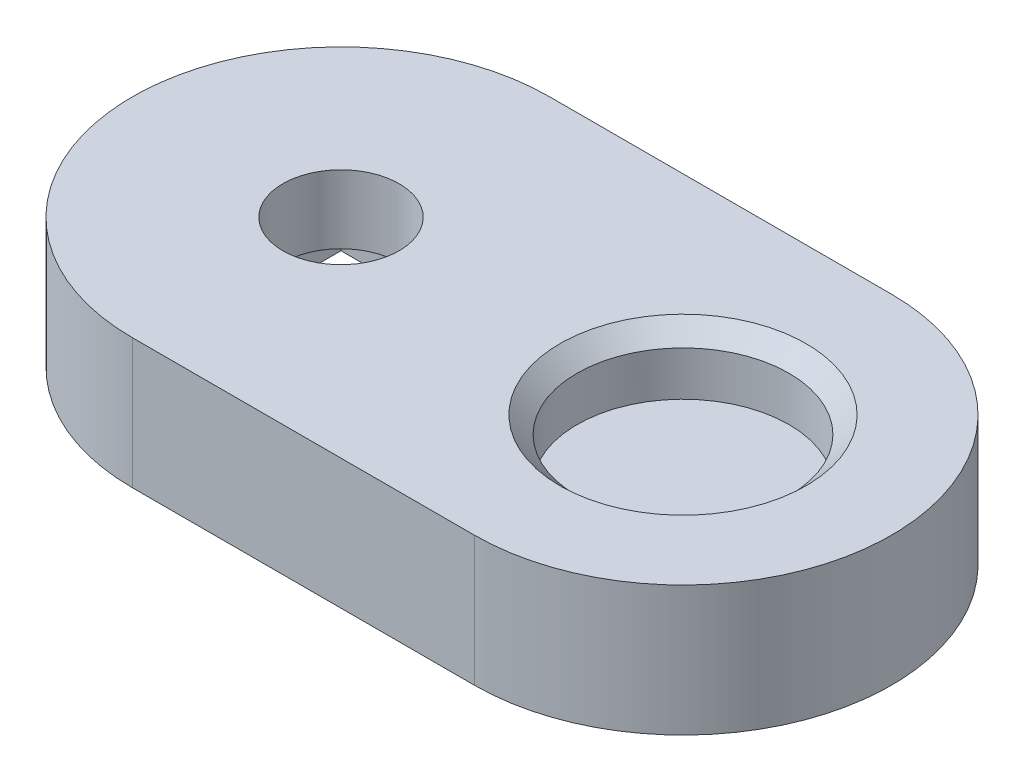
ISO-10303-21;
HEADER;
FILE_DESCRIPTION(('STEP AP214'),'2;1');
FILE_NAME('part.step','',(''),(''),'','','');
FILE_SCHEMA(('AUTOMOTIVE_DESIGN { 1 0 10303 214 1 1 1 1 }'));
ENDSEC;
DATA;
#1=APPLICATION_CONTEXT('core data for automotive mechanical design processes');
#2=APPLICATION_PROTOCOL_DEFINITION('international standard','automotive_design',2000,#1);
#3=PRODUCT_CONTEXT('',#1,'mechanical');
#4=PRODUCT('Part','Part','',(#3));
#5=PRODUCT_RELATED_PRODUCT_CATEGORY('part','',(#4));
#6=PRODUCT_DEFINITION_FORMATION('','',#4);
#7=PRODUCT_DEFINITION_CONTEXT('part definition',#1,'design');
#8=PRODUCT_DEFINITION('design','',#6,#7);
#9=PRODUCT_DEFINITION_SHAPE('','',#8);
#10=(LENGTH_UNIT() NAMED_UNIT(*) SI_UNIT(.MILLI.,.METRE.));
#11=(NAMED_UNIT(*) PLANE_ANGLE_UNIT() SI_UNIT($,.RADIAN.));
#12=(NAMED_UNIT(*) SI_UNIT($,.STERADIAN.) SOLID_ANGLE_UNIT());
#13=UNCERTAINTY_MEASURE_WITH_UNIT(LENGTH_MEASURE(1.E-05),#10,'distance_accuracy_value','');
#14=(GEOMETRIC_REPRESENTATION_CONTEXT(3) GLOBAL_UNCERTAINTY_ASSIGNED_CONTEXT((#13)) GLOBAL_UNIT_ASSIGNED_CONTEXT((#10,
#11,#12)) REPRESENTATION_CONTEXT('',''));
#15=CARTESIAN_POINT('',(0.,0.,0.));
#16=DIRECTION('',(0.,0.,1.));
#17=DIRECTION('',(1.,0.,0.));
#18=AXIS2_PLACEMENT_3D('',#15,#16,#17);
#19=CARTESIAN_POINT('',(-2.05,3.8,2.95));
#20=DIRECTION('',(-1.,0.,0.));
#21=DIRECTION('',(0.,0.,1.));
#22=AXIS2_PLACEMENT_3D('',#19,#20,#21);
#23=PLANE('',#22);
#24=DIRECTION('',(0.,-1.,0.));
#25=VECTOR('',#24,1.);
#26=CARTESIAN_POINT('',(-2.05,3.8,2.95));
#27=LINE('',#26,#25);
#28=CARTESIAN_POINT('',(-2.05,1.8,2.95));
#29=VERTEX_POINT('',#28);
#30=CARTESIAN_POINT('',(-2.05,0.,2.95));
#31=VERTEX_POINT('',#30);
#32=EDGE_CURVE('E58',#29,#31,#27,.T.);
#33=ORIENTED_EDGE('',*,*,#32,.F.);
#34=DIRECTION('',(0.,0.,1.));
#35=VECTOR('',#34,1.);
#36=CARTESIAN_POINT('',(-2.05,1.8,-2.95));
#37=LINE('',#36,#35);
#38=CARTESIAN_POINT('',(-2.05,1.8,-2.95));
#39=VERTEX_POINT('',#38);
#40=EDGE_CURVE('E51',#39,#29,#37,.T.);
#41=ORIENTED_EDGE('',*,*,#40,.F.);
#42=DIRECTION('',(0.,-1.,0.));
#43=VECTOR('',#42,1.);
#44=CARTESIAN_POINT('',(-2.05,3.8,-2.95));
#45=LINE('',#44,#43);
#46=CARTESIAN_POINT('',(-2.05,0.,-2.95));
#47=VERTEX_POINT('',#46);
#48=EDGE_CURVE('E117',#39,#47,#45,.T.);
#49=ORIENTED_EDGE('',*,*,#48,.T.);
#50=DIRECTION('',(0.,0.,-1.));
#51=VECTOR('',#50,1.);
#52=CARTESIAN_POINT('',(-2.05,0.,2.95));
#53=LINE('',#52,#51);
#54=EDGE_CURVE('E236',#31,#47,#53,.T.);
#55=ORIENTED_EDGE('',*,*,#54,.F.);
#56=EDGE_LOOP('',(#33,#41,#49,#55));
#57=FACE_BOUND('',#56,.T.);
#58=ADVANCED_FACE('F36',(#57),#23,.T.);
#59=CARTESIAN_POINT('',(-7.95,3.8,-2.95));
#60=DIRECTION('',(0.,0.,1.));
#61=DIRECTION('',(1.,0.,0.));
#62=AXIS2_PLACEMENT_3D('',#59,#60,#61);
#63=PLANE('',#62);
#64=ORIENTED_EDGE('',*,*,#48,.F.);
#65=DIRECTION('',(1.,0.,0.));
#66=VECTOR('',#65,1.);
#67=CARTESIAN_POINT('',(-7.95,1.8,-2.95));
#68=LINE('',#67,#66);
#69=CARTESIAN_POINT('',(-7.95,1.8,-2.95));
#70=VERTEX_POINT('',#69);
#71=EDGE_CURVE('E104',#70,#39,#68,.T.);
#72=ORIENTED_EDGE('',*,*,#71,.F.);
#73=DIRECTION('',(0.,-1.,0.));
#74=VECTOR('',#73,1.);
#75=CARTESIAN_POINT('',(-7.95,3.8,-2.95));
#76=LINE('',#75,#74);
#77=CARTESIAN_POINT('',(-7.95,0.,-2.95));
#78=VERTEX_POINT('',#77);
#79=EDGE_CURVE('E115',#70,#78,#76,.T.);
#80=ORIENTED_EDGE('',*,*,#79,.T.);
#81=DIRECTION('',(-1.,0.,0.));
#82=VECTOR('',#81,1.);
#83=CARTESIAN_POINT('',(-7.95,0.,-2.95));
#84=LINE('',#83,#82);
#85=EDGE_CURVE('E239',#47,#78,#84,.T.);
#86=ORIENTED_EDGE('',*,*,#85,.F.);
#87=EDGE_LOOP('',(#64,#72,#80,#86));
#88=FACE_BOUND('',#87,.T.);
#89=ADVANCED_FACE('F113',(#88),#63,.T.);
#90=CARTESIAN_POINT('',(-7.95,3.8,2.95));
#91=DIRECTION('',(1.,0.,0.));
#92=DIRECTION('',(0.,0.,-1.));
#93=AXIS2_PLACEMENT_3D('',#90,#91,#92);
#94=PLANE('',#93);
#95=ORIENTED_EDGE('',*,*,#79,.F.);
#96=DIRECTION('',(0.,0.,-1.));
#97=VECTOR('',#96,1.);
#98=CARTESIAN_POINT('',(-7.95,1.8,-2.95));
#99=LINE('',#98,#97);
#100=CARTESIAN_POINT('',(-7.95,1.8,2.95));
#101=VERTEX_POINT('',#100);
#102=EDGE_CURVE('E100',#101,#70,#99,.T.);
#103=ORIENTED_EDGE('',*,*,#102,.F.);
#104=DIRECTION('',(0.,-1.,0.));
#105=VECTOR('',#104,1.);
#106=CARTESIAN_POINT('',(-7.95,3.8,2.95));
#107=LINE('',#106,#105);
#108=CARTESIAN_POINT('',(-7.95,0.,2.95));
#109=VERTEX_POINT('',#108);
#110=EDGE_CURVE('E124',#101,#109,#107,.T.);
#111=ORIENTED_EDGE('',*,*,#110,.T.);
#112=DIRECTION('',(0.,0.,1.));
#113=VECTOR('',#112,1.);
#114=CARTESIAN_POINT('',(-7.95,0.,2.95));
#115=LINE('',#114,#113);
#116=EDGE_CURVE('E122',#78,#109,#115,.T.);
#117=ORIENTED_EDGE('',*,*,#116,.F.);
#118=EDGE_LOOP('',(#95,#103,#111,#117));
#119=FACE_BOUND('',#118,.T.);
#120=ADVANCED_FACE('F120',(#119),#94,.T.);
#121=CARTESIAN_POINT('',(-7.95,3.8,2.95));
#122=DIRECTION('',(0.,0.,-1.));
#123=DIRECTION('',(-1.,0.,0.));
#124=AXIS2_PLACEMENT_3D('',#121,#122,#123);
#125=PLANE('',#124);
#126=ORIENTED_EDGE('',*,*,#110,.F.);
#127=DIRECTION('',(-1.,0.,0.));
#128=VECTOR('',#127,1.);
#129=CARTESIAN_POINT('',(-7.95,1.8,2.95));
#130=LINE('',#129,#128);
#131=EDGE_CURVE('E105',#29,#101,#130,.T.);
#132=ORIENTED_EDGE('',*,*,#131,.F.);
#133=ORIENTED_EDGE('',*,*,#32,.T.);
#134=DIRECTION('',(1.,0.,0.));
#135=VECTOR('',#134,1.);
#136=CARTESIAN_POINT('',(-7.95,0.,2.95));
#137=LINE('',#136,#135);
#138=EDGE_CURVE('E242',#109,#31,#137,.T.);
#139=ORIENTED_EDGE('',*,*,#138,.F.);
#140=EDGE_LOOP('',(#126,#132,#133,#139));
#141=FACE_BOUND('',#140,.T.);
#142=ADVANCED_FACE('F194',(#141),#125,.T.);
#143=CARTESIAN_POINT('',(-5.,3.8,0.));
#144=DIRECTION('',(0.,1.,0.));
#145=DIRECTION('',(0.,0.,1.));
#146=AXIS2_PLACEMENT_3D('',#143,#144,#145);
#147=PLANE('',#146);
#148=CARTESIAN_POINT('',(5.,3.8,0.));
#149=DIRECTION('',(0.,1.,0.));
#150=DIRECTION('',(0.,0.,1.));
#151=AXIS2_PLACEMENT_3D('',#148,#149,#150);
#152=CIRCLE('',#151,3.60000000000001);
#153=CARTESIAN_POINT('',(5.,3.8,3.60000000000001));
#154=VERTEX_POINT('',#153);
#155=EDGE_CURVE('E12',#154,#154,#152,.F.);
#156=ORIENTED_EDGE('',*,*,#155,.T.);
#157=EDGE_LOOP('',(#156));
#158=FACE_BOUND('',#157,.T.);
#159=CARTESIAN_POINT('',(-5.,3.8,0.));
#160=DIRECTION('',(0.,1.,0.));
#161=DIRECTION('',(0.,0.,1.));
#162=AXIS2_PLACEMENT_3D('',#159,#160,#161);
#163=CIRCLE('',#162,6.1);
#164=CARTESIAN_POINT('',(-5.,3.8,-6.1));
#165=VERTEX_POINT('',#164);
#166=CARTESIAN_POINT('',(-5.,3.8,6.1));
#167=VERTEX_POINT('',#166);
#168=EDGE_CURVE('E131',#165,#167,#163,.T.);
#169=ORIENTED_EDGE('',*,*,#168,.T.);
#170=DIRECTION('',(1.,0.,0.));
#171=VECTOR('',#170,1.);
#172=CARTESIAN_POINT('',(-5.,3.8,6.1));
#173=LINE('',#172,#171);
#174=CARTESIAN_POINT('',(5.,3.8,6.1));
#175=VERTEX_POINT('',#174);
#176=EDGE_CURVE('E134',#167,#175,#173,.T.);
#177=ORIENTED_EDGE('',*,*,#176,.T.);
#178=CARTESIAN_POINT('',(5.,3.8,0.));
#179=DIRECTION('',(0.,1.,0.));
#180=DIRECTION('',(0.,0.,1.));
#181=AXIS2_PLACEMENT_3D('',#178,#179,#180);
#182=CIRCLE('',#181,6.1);
#183=CARTESIAN_POINT('',(5.,3.8,-6.1));
#184=VERTEX_POINT('',#183);
#185=EDGE_CURVE('E137',#175,#184,#182,.T.);
#186=ORIENTED_EDGE('',*,*,#185,.T.);
#187=DIRECTION('',(-1.,0.,0.));
#188=VECTOR('',#187,1.);
#189=CARTESIAN_POINT('',(-5.,3.8,-6.1));
#190=LINE('',#189,#188);
#191=EDGE_CURVE('E139',#184,#165,#190,.T.);
#192=ORIENTED_EDGE('',*,*,#191,.T.);
#193=EDGE_LOOP('',(#169,#177,#186,#192));
#194=FACE_BOUND('',#193,.T.);
#195=CARTESIAN_POINT('',(-5.,3.8,0.));
#196=DIRECTION('',(0.,1.,0.));
#197=DIRECTION('',(0.,0.,1.));
#198=AXIS2_PLACEMENT_3D('',#195,#196,#197);
#199=CIRCLE('',#198,1.7);
#200=CARTESIAN_POINT('',(-5.,3.8,1.7));
#201=VERTEX_POINT('',#200);
#202=EDGE_CURVE('E109',#201,#201,#199,.T.);
#203=ORIENTED_EDGE('',*,*,#202,.F.);
#204=EDGE_LOOP('',(#203));
#205=FACE_BOUND('',#204,.T.);
#206=ADVANCED_FACE('F190',(#158,#194,#205),#147,.T.);
#207=CARTESIAN_POINT('',(-5.,0.,0.));
#208=DIRECTION('',(0.,1.,0.));
#209=DIRECTION('',(0.,0.,1.));
#210=AXIS2_PLACEMENT_3D('',#207,#208,#209);
#211=PLANE('',#210);
#212=CARTESIAN_POINT('',(-5.,0.,0.));
#213=DIRECTION('',(0.,1.,0.));
#214=DIRECTION('',(0.,0.,1.));
#215=AXIS2_PLACEMENT_3D('',#212,#213,#214);
#216=CIRCLE('',#215,6.1);
#217=CARTESIAN_POINT('',(-5.,0.,-6.1));
#218=VERTEX_POINT('',#217);
#219=CARTESIAN_POINT('',(-5.,0.,6.1));
#220=VERTEX_POINT('',#219);
#221=EDGE_CURVE('E126',#218,#220,#216,.T.);
#222=ORIENTED_EDGE('',*,*,#221,.F.);
#223=DIRECTION('',(-1.,0.,0.));
#224=VECTOR('',#223,1.);
#225=CARTESIAN_POINT('',(-5.,0.,-6.1));
#226=LINE('',#225,#224);
#227=CARTESIAN_POINT('',(5.,0.,-6.1));
#228=VERTEX_POINT('',#227);
#229=EDGE_CURVE('E135',#228,#218,#226,.T.);
#230=ORIENTED_EDGE('',*,*,#229,.F.);
#231=CARTESIAN_POINT('',(5.,0.,0.));
#232=DIRECTION('',(0.,1.,0.));
#233=DIRECTION('',(0.,0.,1.));
#234=AXIS2_PLACEMENT_3D('',#231,#232,#233);
#235=CIRCLE('',#234,6.1);
#236=CARTESIAN_POINT('',(5.,0.,6.1));
#237=VERTEX_POINT('',#236);
#238=EDGE_CURVE('E146',#237,#228,#235,.T.);
#239=ORIENTED_EDGE('',*,*,#238,.F.);
#240=DIRECTION('',(1.,0.,0.));
#241=VECTOR('',#240,1.);
#242=CARTESIAN_POINT('',(-5.,0.,6.1));
#243=LINE('',#242,#241);
#244=EDGE_CURVE('E144',#220,#237,#243,.T.);
#245=ORIENTED_EDGE('',*,*,#244,.F.);
#246=EDGE_LOOP('',(#222,#230,#239,#245));
#247=FACE_BOUND('',#246,.T.);
#248=ORIENTED_EDGE('',*,*,#54,.T.);
#249=ORIENTED_EDGE('',*,*,#85,.T.);
#250=ORIENTED_EDGE('',*,*,#116,.T.);
#251=ORIENTED_EDGE('',*,*,#138,.T.);
#252=EDGE_LOOP('',(#248,#249,#250,#251));
#253=FACE_BOUND('',#252,.T.);
#254=ADVANCED_FACE('F193',(#247,#253),#211,.F.);
#255=CARTESIAN_POINT('',(-5.,3.8,0.));
#256=DIRECTION('',(0.,-1.,0.));
#257=DIRECTION('',(0.,0.,-1.));
#258=AXIS2_PLACEMENT_3D('',#255,#256,#257);
#259=CYLINDRICAL_SURFACE('',#258,6.1);
#260=ORIENTED_EDGE('',*,*,#221,.T.);
#261=DIRECTION('',(0.,-1.,0.));
#262=VECTOR('',#261,1.);
#263=CARTESIAN_POINT('',(-5.,3.8,6.1));
#264=LINE('',#263,#262);
#265=EDGE_CURVE('E157',#167,#220,#264,.T.);
#266=ORIENTED_EDGE('',*,*,#265,.F.);
#267=ORIENTED_EDGE('',*,*,#168,.F.);
#268=DIRECTION('',(0.,-1.,0.));
#269=VECTOR('',#268,1.);
#270=CARTESIAN_POINT('',(-5.,3.8,-6.1));
#271=LINE('',#270,#269);
#272=EDGE_CURVE('E141',#165,#218,#271,.T.);
#273=ORIENTED_EDGE('',*,*,#272,.T.);
#274=EDGE_LOOP('',(#260,#266,#267,#273));
#275=FACE_BOUND('',#274,.T.);
#276=ADVANCED_FACE('F198',(#275),#259,.T.);
#277=CARTESIAN_POINT('',(-5.,3.8,6.1));
#278=DIRECTION('',(0.,0.,-1.));
#279=DIRECTION('',(-1.,0.,0.));
#280=AXIS2_PLACEMENT_3D('',#277,#278,#279);
#281=PLANE('',#280);
#282=ORIENTED_EDGE('',*,*,#244,.T.);
#283=DIRECTION('',(0.,-1.,0.));
#284=VECTOR('',#283,1.);
#285=CARTESIAN_POINT('',(5.,3.8,6.1));
#286=LINE('',#285,#284);
#287=EDGE_CURVE('E154',#175,#237,#286,.T.);
#288=ORIENTED_EDGE('',*,*,#287,.F.);
#289=ORIENTED_EDGE('',*,*,#176,.F.);
#290=ORIENTED_EDGE('',*,*,#265,.T.);
#291=EDGE_LOOP('',(#282,#288,#289,#290));
#292=FACE_BOUND('',#291,.T.);
#293=ADVANCED_FACE('F206',(#292),#281,.F.);
#294=CARTESIAN_POINT('',(5.,3.8,0.));
#295=DIRECTION('',(0.,-1.,0.));
#296=DIRECTION('',(0.,0.,-1.));
#297=AXIS2_PLACEMENT_3D('',#294,#295,#296);
#298=CYLINDRICAL_SURFACE('',#297,6.1);
#299=ORIENTED_EDGE('',*,*,#238,.T.);
#300=DIRECTION('',(0.,-1.,0.));
#301=VECTOR('',#300,1.);
#302=CARTESIAN_POINT('',(5.,3.8,-6.1));
#303=LINE('',#302,#301);
#304=EDGE_CURVE('E151',#184,#228,#303,.T.);
#305=ORIENTED_EDGE('',*,*,#304,.F.);
#306=ORIENTED_EDGE('',*,*,#185,.F.);
#307=ORIENTED_EDGE('',*,*,#287,.T.);
#308=EDGE_LOOP('',(#299,#305,#306,#307));
#309=FACE_BOUND('',#308,.T.);
#310=ADVANCED_FACE('F202',(#309),#298,.T.);
#311=CARTESIAN_POINT('',(-5.,3.8,-6.1));
#312=DIRECTION('',(0.,0.,1.));
#313=DIRECTION('',(1.,0.,0.));
#314=AXIS2_PLACEMENT_3D('',#311,#312,#313);
#315=PLANE('',#314);
#316=ORIENTED_EDGE('',*,*,#229,.T.);
#317=ORIENTED_EDGE('',*,*,#272,.F.);
#318=ORIENTED_EDGE('',*,*,#191,.F.);
#319=ORIENTED_EDGE('',*,*,#304,.T.);
#320=EDGE_LOOP('',(#316,#317,#318,#319));
#321=FACE_BOUND('',#320,.T.);
#322=ADVANCED_FACE('F189',(#321),#315,.F.);
#323=CARTESIAN_POINT('',(5.,3.8,0.));
#324=DIRECTION('',(0.,-1.,0.));
#325=DIRECTION('',(0.,0.,-1.));
#326=AXIS2_PLACEMENT_3D('',#323,#324,#325);
#327=CYLINDRICAL_SURFACE('',#326,3.1);
#328=CARTESIAN_POINT('',(5.,3.29999999999999,0.));
#329=DIRECTION('',(0.,1.,0.));
#330=DIRECTION('',(0.,0.,1.));
#331=AXIS2_PLACEMENT_3D('',#328,#329,#330);
#332=CIRCLE('',#331,3.1);
#333=CARTESIAN_POINT('',(5.,3.29999999999999,-3.1));
#334=VERTEX_POINT('',#333);
#335=EDGE_CURVE('E44',#334,#334,#332,.T.);
#336=CARTESIAN_POINT('',(5.,2.,0.));
#337=DIRECTION('',(0.,1.,0.));
#338=DIRECTION('',(0.,0.,1.));
#339=AXIS2_PLACEMENT_3D('',#336,#337,#338);
#340=CIRCLE('',#339,3.1);
#341=CARTESIAN_POINT('',(5.,2.,-3.1));
#342=VERTEX_POINT('',#341);
#343=EDGE_CURVE('E160',#342,#342,#340,.T.);
#344=CARTESIAN_POINT('',(5.,3.29999999999999,-3.1));
#345=CARTESIAN_POINT('',(5.,3.28645833333332,-3.1));
#346=CARTESIAN_POINT('',(5.,3.27291666666666,-3.1));
#347=CARTESIAN_POINT('',(5.,3.24583333333332,-3.1));
#348=CARTESIAN_POINT('',(5.,3.23229166666666,-3.1));
#349=CARTESIAN_POINT('',(5.,3.20520833333332,-3.1));
#350=CARTESIAN_POINT('',(5.,3.19166666666666,-3.1));
#351=CARTESIAN_POINT('',(5.,3.16458333333332,-3.1));
#352=CARTESIAN_POINT('',(5.,3.15104166666666,-3.1));
#353=CARTESIAN_POINT('',(5.,3.12395833333332,-3.1));
#354=CARTESIAN_POINT('',(5.,3.11041666666666,-3.1));
#355=CARTESIAN_POINT('',(5.,3.08333333333333,-3.1));
#356=CARTESIAN_POINT('',(5.,3.06979166666666,-3.1));
#357=CARTESIAN_POINT('',(5.,3.04270833333333,-3.1));
#358=CARTESIAN_POINT('',(5.,3.02916666666666,-3.1));
#359=CARTESIAN_POINT('',(5.,3.00208333333333,-3.1));
#360=CARTESIAN_POINT('',(5.,2.98854166666666,-3.1));
#361=CARTESIAN_POINT('',(5.,2.96145833333333,-3.1));
#362=CARTESIAN_POINT('',(5.,2.94791666666666,-3.1));
#363=CARTESIAN_POINT('',(5.,2.92083333333333,-3.1));
#364=CARTESIAN_POINT('',(5.,2.90729166666666,-3.1));
#365=CARTESIAN_POINT('',(5.,2.88020833333333,-3.1));
#366=CARTESIAN_POINT('',(5.,2.86666666666666,-3.1));
#367=CARTESIAN_POINT('',(5.,2.83958333333333,-3.1));
#368=CARTESIAN_POINT('',(5.,2.82604166666666,-3.1));
#369=CARTESIAN_POINT('',(5.,2.79895833333333,-3.1));
#370=CARTESIAN_POINT('',(5.,2.78541666666666,-3.1));
#371=CARTESIAN_POINT('',(5.,2.75833333333333,-3.1));
#372=CARTESIAN_POINT('',(5.,2.74479166666666,-3.1));
#373=CARTESIAN_POINT('',(5.,2.71770833333333,-3.1));
#374=CARTESIAN_POINT('',(5.,2.70416666666666,-3.1));
#375=CARTESIAN_POINT('',(5.,2.67708333333333,-3.1));
#376=CARTESIAN_POINT('',(5.,2.66354166666666,-3.1));
#377=CARTESIAN_POINT('',(5.,2.63645833333333,-3.1));
#378=CARTESIAN_POINT('',(5.,2.62291666666666,-3.1));
#379=CARTESIAN_POINT('',(5.,2.59583333333333,-3.1));
#380=CARTESIAN_POINT('',(5.,2.58229166666666,-3.1));
#381=CARTESIAN_POINT('',(5.,2.55520833333333,-3.1));
#382=CARTESIAN_POINT('',(5.,2.54166666666666,-3.1));
#383=CARTESIAN_POINT('',(5.,2.51458333333333,-3.1));
#384=CARTESIAN_POINT('',(5.,2.50104166666666,-3.1));
#385=CARTESIAN_POINT('',(5.,2.47395833333333,-3.1));
#386=CARTESIAN_POINT('',(5.,2.46041666666666,-3.1));
#387=CARTESIAN_POINT('',(5.,2.43333333333333,-3.1));
#388=CARTESIAN_POINT('',(5.,2.41979166666666,-3.1));
#389=CARTESIAN_POINT('',(5.,2.39270833333333,-3.1));
#390=CARTESIAN_POINT('',(5.,2.37916666666666,-3.1));
#391=CARTESIAN_POINT('',(5.,2.35208333333333,-3.1));
#392=CARTESIAN_POINT('',(5.,2.33854166666666,-3.1));
#393=CARTESIAN_POINT('',(5.,2.31145833333333,-3.1));
#394=CARTESIAN_POINT('',(5.,2.29791666666666,-3.1));
#395=CARTESIAN_POINT('',(5.,2.27083333333333,-3.1));
#396=CARTESIAN_POINT('',(5.,2.25729166666666,-3.1));
#397=CARTESIAN_POINT('',(5.,2.23020833333333,-3.1));
#398=CARTESIAN_POINT('',(5.,2.21666666666667,-3.1));
#399=CARTESIAN_POINT('',(5.,2.18958333333333,-3.1));
#400=CARTESIAN_POINT('',(5.,2.17604166666667,-3.1));
#401=CARTESIAN_POINT('',(5.,2.14895833333333,-3.1));
#402=CARTESIAN_POINT('',(5.,2.13541666666667,-3.1));
#403=CARTESIAN_POINT('',(5.,2.10833333333333,-3.1));
#404=CARTESIAN_POINT('',(5.,2.09479166666667,-3.1));
#405=CARTESIAN_POINT('',(5.,2.06770833333333,-3.1));
#406=CARTESIAN_POINT('',(5.,2.05416666666667,-3.1));
#407=CARTESIAN_POINT('',(5.,2.02708333333333,-3.1));
#408=CARTESIAN_POINT('',(5.,2.01354166666667,-3.1));
#409=CARTESIAN_POINT('',(5.,2.,-3.1));
#410=B_SPLINE_CURVE_WITH_KNOTS('',3,(#344,#345,#346,#347,#348,#349,#350,#351,#352,#353,#354,
#355,#356,#357,#358,#359,#360,#361,#362,#363,#364,#365,#366,#367,#368,#369,#370,#371,#372,#373,
#374,#375,#376,#377,#378,#379,#380,#381,#382,#383,#384,#385,#386,#387,#388,#389,#390,#391,#392,
#393,#394,#395,#396,#397,#398,#399,#400,#401,#402,#403,#404,#405,#406,#407,#408,#409),
.UNSPECIFIED.,.F.,.F.,(4,2,2,2,2,2,2,2,2,2,2,2,2,2,2,2,2,2,2,2,2,2,2,2,2,2,2,2,2,2,2,2,4),(0.,
0.0406249999999994,0.0812499999999993,0.121874999999999,0.162499999999999,0.203124999999998,
0.243749999999998,0.284374999999998,0.324999999999998,0.365624999999997,0.406249999999997,
0.446874999999997,0.487499999999996,0.528124999999996,0.568749999999996,0.609374999999995,
0.649999999999995,0.690624999999995,0.731249999999995,0.771874999999994,0.812499999999994,
0.853124999999993,0.893749999999993,0.934374999999993,0.974999999999993,1.01562499999999,
1.05624999999999,1.09687499999999,1.13749999999999,1.17812499999999,1.21874999999999,
1.25937499999999,1.29999999999999),.UNSPECIFIED.);
#411=EDGE_CURVE('BSEAM165',#334,#342,#410,.T.);
#412=ORIENTED_EDGE('',*,*,#335,.T.);
#413=ORIENTED_EDGE('',*,*,#343,.F.);
#414=ORIENTED_EDGE('',*,*,#411,.T.);
#415=ORIENTED_EDGE('',*,*,#411,.F.);
#416=EDGE_LOOP('',(#412,#414,#413,#415));
#417=FACE_BOUND('',#416,.T.);
#418=ADVANCED_FACE('F165',(#417),#327,.F.);
#419=CARTESIAN_POINT('',(-5.,-8.34386001800126,0.));
#420=DIRECTION('',(0.,1.,0.));
#421=DIRECTION('',(0.,0.,1.));
#422=AXIS2_PLACEMENT_3D('',#419,#420,#421);
#423=CYLINDRICAL_SURFACE('',#422,1.7);
#424=CARTESIAN_POINT('',(-5.,1.8,0.));
#425=DIRECTION('',(0.,1.,0.));
#426=DIRECTION('',(0.,0.,1.));
#427=AXIS2_PLACEMENT_3D('',#424,#425,#426);
#428=CIRCLE('',#427,1.7);
#429=CARTESIAN_POINT('',(-5.,1.8,1.7));
#430=VERTEX_POINT('',#429);
#431=EDGE_CURVE('E118',#430,#430,#428,.F.);
#432=ORIENTED_EDGE('',*,*,#431,.T.);
#433=EDGE_LOOP('',(#432));
#434=FACE_BOUND('',#433,.T.);
#435=ORIENTED_EDGE('',*,*,#202,.T.);
#436=EDGE_LOOP('',(#435));
#437=FACE_BOUND('',#436,.T.);
#438=ADVANCED_FACE('F188',(#434,#437),#423,.F.);
#439=CARTESIAN_POINT('',(-5.,1.8,0.));
#440=DIRECTION('',(0.,1.,0.));
#441=DIRECTION('',(0.,0.,1.));
#442=AXIS2_PLACEMENT_3D('',#439,#440,#441);
#443=PLANE('',#442);
#444=ORIENTED_EDGE('',*,*,#40,.T.);
#445=ORIENTED_EDGE('',*,*,#131,.T.);
#446=ORIENTED_EDGE('',*,*,#102,.T.);
#447=ORIENTED_EDGE('',*,*,#71,.T.);
#448=EDGE_LOOP('',(#444,#445,#446,#447));
#449=FACE_BOUND('',#448,.T.);
#450=ORIENTED_EDGE('',*,*,#431,.F.);
#451=EDGE_LOOP('',(#450));
#452=FACE_BOUND('',#451,.T.);
#453=ADVANCED_FACE('F102',(#449,#452),#443,.F.);
#454=CARTESIAN_POINT('',(-5.,2.,0.));
#455=DIRECTION('',(0.,1.,0.));
#456=DIRECTION('',(0.,0.,1.));
#457=AXIS2_PLACEMENT_3D('',#454,#455,#456);
#458=PLANE('',#457);
#459=ORIENTED_EDGE('',*,*,#343,.T.);
#460=EDGE_LOOP('',(#459));
#461=FACE_BOUND('',#460,.T.);
#462=ADVANCED_FACE('F169',(#461),#458,.T.);
#463=CARTESIAN_POINT('',(5.,3.29999999999999,0.));
#464=DIRECTION('',(0.,1.,0.));
#465=DIRECTION('',(0.,0.,1.));
#466=AXIS2_PLACEMENT_3D('',#463,#464,#465);
#467=CONICAL_SURFACE('',#466,3.1,0.785398163397452);
#468=ORIENTED_EDGE('',*,*,#155,.F.);
#469=EDGE_LOOP('',(#468));
#470=FACE_BOUND('',#469,.T.);
#471=ORIENTED_EDGE('',*,*,#335,.F.);
#472=EDGE_LOOP('',(#471));
#473=FACE_BOUND('',#472,.T.);
#474=ADVANCED_FACE('F38',(#470,#473),#467,.F.);
#475=CLOSED_SHELL('',(#58,#89,#120,#142,#206,#254,#276,#293,#310,#322,#418,#438,#453,#462,#474));
#476=MANIFOLD_SOLID_BREP('B2',#475);
#477=ADVANCED_BREP_SHAPE_REPRESENTATION('',(#18,#476),#14);
#478=SHAPE_DEFINITION_REPRESENTATION(#9,#477);
ENDSEC;
END-ISO-10303-21;
